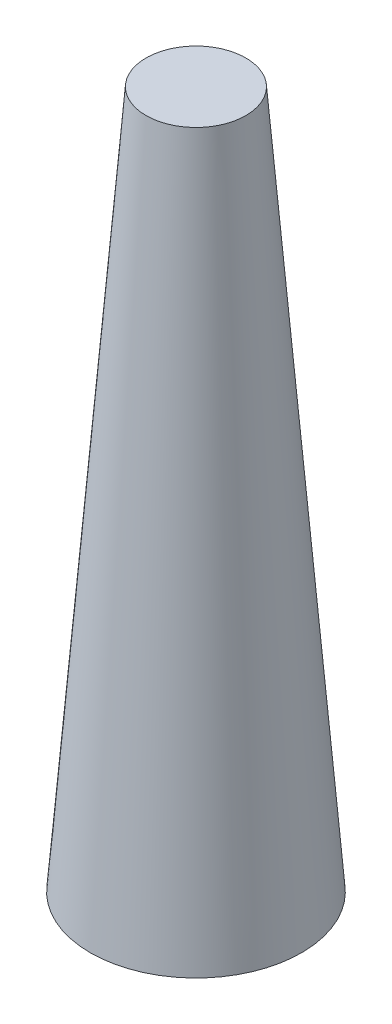
ISO-10303-21;
HEADER;
FILE_DESCRIPTION(('STEP AP214'),'2;1');
FILE_NAME('part.step','',(''),(''),'','','');
FILE_SCHEMA(('AUTOMOTIVE_DESIGN { 1 0 10303 214 1 1 1 1 }'));
ENDSEC;
DATA;
#1=APPLICATION_CONTEXT('core data for automotive mechanical design processes');
#2=APPLICATION_PROTOCOL_DEFINITION('international standard','automotive_design',2000,#1);
#3=PRODUCT_CONTEXT('',#1,'mechanical');
#4=PRODUCT('Part','Part','',(#3));
#5=PRODUCT_RELATED_PRODUCT_CATEGORY('part','',(#4));
#6=PRODUCT_DEFINITION_FORMATION('','',#4);
#7=PRODUCT_DEFINITION_CONTEXT('part definition',#1,'design');
#8=PRODUCT_DEFINITION('design','',#6,#7);
#9=PRODUCT_DEFINITION_SHAPE('','',#8);
#10=(LENGTH_UNIT() NAMED_UNIT(*) SI_UNIT(.MILLI.,.METRE.));
#11=(NAMED_UNIT(*) PLANE_ANGLE_UNIT() SI_UNIT($,.RADIAN.));
#12=(NAMED_UNIT(*) SI_UNIT($,.STERADIAN.) SOLID_ANGLE_UNIT());
#13=UNCERTAINTY_MEASURE_WITH_UNIT(LENGTH_MEASURE(1.E-05),#10,'distance_accuracy_value','');
#14=(GEOMETRIC_REPRESENTATION_CONTEXT(3) GLOBAL_UNCERTAINTY_ASSIGNED_CONTEXT((#13)) GLOBAL_UNIT_ASSIGNED_CONTEXT((#10,
#11,#12)) REPRESENTATION_CONTEXT('',''));
#15=CARTESIAN_POINT('',(0.,0.,0.));
#16=DIRECTION('',(0.,0.,1.));
#17=DIRECTION('',(1.,0.,0.));
#18=AXIS2_PLACEMENT_3D('',#15,#16,#17);
#19=CARTESIAN_POINT('',(0.,0.,0.));
#20=DIRECTION('',(0.,1.,0.));
#21=DIRECTION('',(0.,0.,1.));
#22=AXIS2_PLACEMENT_3D('',#19,#20,#21);
#23=PLANE('',#22);
#24=CARTESIAN_POINT('',(0.,0.,0.));
#25=DIRECTION('',(0.,1.,0.));
#26=DIRECTION('',(0.,0.,1.));
#27=AXIS2_PLACEMENT_3D('',#24,#25,#26);
#28=CIRCLE('',#27,2.54);
#29=CARTESIAN_POINT('',(0.,0.,2.54));
#30=VERTEX_POINT('',#29);
#31=EDGE_CURVE('E45',#30,#30,#28,.T.);
#32=ORIENTED_EDGE('',*,*,#31,.F.);
#33=EDGE_LOOP('',(#32));
#34=FACE_BOUND('',#33,.T.);
#35=ADVANCED_FACE('F37',(#34),#23,.F.);
#36=CARTESIAN_POINT('',(0.,16.764,0.));
#37=DIRECTION('',(0.,1.,0.));
#38=DIRECTION('',(0.,0.,1.));
#39=AXIS2_PLACEMENT_3D('',#36,#37,#38);
#40=PLANE('',#39);
#41=CARTESIAN_POINT('',(0.,16.764,0.));
#42=DIRECTION('',(0.,1.,0.));
#43=DIRECTION('',(0.,0.,1.));
#44=AXIS2_PLACEMENT_3D('',#41,#42,#43);
#45=CIRCLE('',#44,1.20015);
#46=CARTESIAN_POINT('',(0.,16.764,1.20015));
#47=VERTEX_POINT('',#46);
#48=EDGE_CURVE('E11',#47,#47,#45,.T.);
#49=ORIENTED_EDGE('',*,*,#48,.T.);
#50=EDGE_LOOP('',(#49));
#51=FACE_BOUND('',#50,.T.);
#52=ADVANCED_FACE('F85',(#51),#40,.T.);
#53=CARTESIAN_POINT('',(0.,16.764,0.));
#54=DIRECTION('',(0.,-1.,0.));
#55=DIRECTION('',(0.,0.,-1.));
#56=AXIS2_PLACEMENT_3D('',#53,#54,#55);
#57=CONICAL_SURFACE('',#56,1.20015,0.079754709448491);
#58=ORIENTED_EDGE('',*,*,#48,.F.);
#59=EDGE_LOOP('',(#58));
#60=FACE_BOUND('',#59,.T.);
#61=ORIENTED_EDGE('',*,*,#31,.T.);
#62=EDGE_LOOP('',(#61));
#63=FACE_BOUND('',#62,.T.);
#64=ADVANCED_FACE('F70',(#60,#63),#57,.T.);
#65=CLOSED_SHELL('',(#35,#52,#64));
#66=MANIFOLD_SOLID_BREP('B2',#65);
#67=ADVANCED_BREP_SHAPE_REPRESENTATION('',(#18,#66),#14);
#68=SHAPE_DEFINITION_REPRESENTATION(#9,#67);
ENDSEC;
END-ISO-10303-21;
